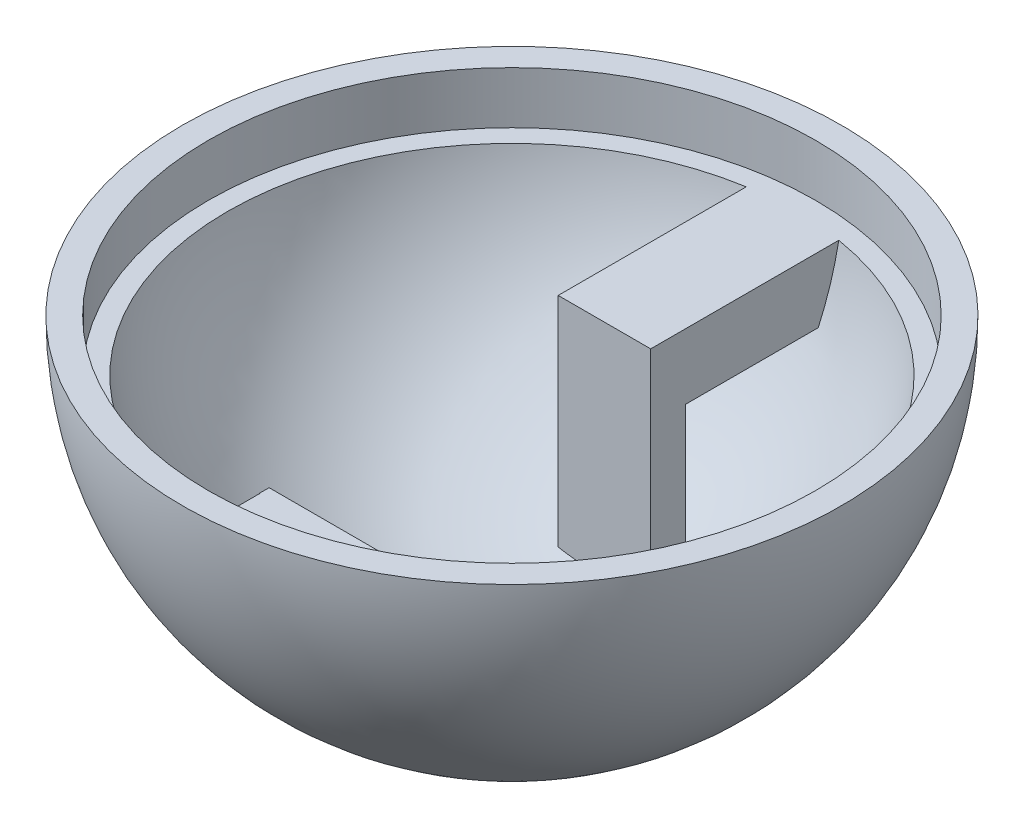
ISO-10303-21;
HEADER;
FILE_DESCRIPTION(('STEP AP214'),'2;1');
FILE_NAME('part.step','',(''),(''),'','','');
FILE_SCHEMA(('AUTOMOTIVE_DESIGN { 1 0 10303 214 1 1 1 1 }'));
ENDSEC;
DATA;
#1=APPLICATION_CONTEXT('core data for automotive mechanical design processes');
#2=APPLICATION_PROTOCOL_DEFINITION('international standard','automotive_design',2000,#1);
#3=PRODUCT_CONTEXT('',#1,'mechanical');
#4=PRODUCT('Part','Part','',(#3));
#5=PRODUCT_RELATED_PRODUCT_CATEGORY('part','',(#4));
#6=PRODUCT_DEFINITION_FORMATION('','',#4);
#7=PRODUCT_DEFINITION_CONTEXT('part definition',#1,'design');
#8=PRODUCT_DEFINITION('design','',#6,#7);
#9=PRODUCT_DEFINITION_SHAPE('','',#8);
#10=(LENGTH_UNIT() NAMED_UNIT(*) SI_UNIT(.MILLI.,.METRE.));
#11=(NAMED_UNIT(*) PLANE_ANGLE_UNIT() SI_UNIT($,.RADIAN.));
#12=(NAMED_UNIT(*) SI_UNIT($,.STERADIAN.) SOLID_ANGLE_UNIT());
#13=UNCERTAINTY_MEASURE_WITH_UNIT(LENGTH_MEASURE(1.E-05),#10,'distance_accuracy_value','');
#14=(GEOMETRIC_REPRESENTATION_CONTEXT(3) GLOBAL_UNCERTAINTY_ASSIGNED_CONTEXT((#13)) GLOBAL_UNIT_ASSIGNED_CONTEXT((#10,
#11,#12)) REPRESENTATION_CONTEXT('',''));
#15=CARTESIAN_POINT('',(0.,0.,0.));
#16=DIRECTION('',(0.,0.,1.));
#17=DIRECTION('',(1.,0.,0.));
#18=AXIS2_PLACEMENT_3D('',#15,#16,#17);
#19=CARTESIAN_POINT('',(0.,0.,0.));
#20=DIRECTION('',(0.,1.,0.));
#21=DIRECTION('',(-1.,0.,0.));
#22=AXIS2_PLACEMENT_3D('',#19,#20,#21);
#23=SPHERICAL_SURFACE('',#22,25.);
#24=CARTESIAN_POINT('',(-4.,0.,0.));
#25=DIRECTION('',(1.,0.,0.));
#26=DIRECTION('',(0.,0.,-1.));
#27=AXIS2_PLACEMENT_3D('',#24,#25,#26);
#28=CIRCLE('',#27,24.6779253585061);
#29=CARTESIAN_POINT('',(-4.,-4.5,-24.2641711171019));
#30=VERTEX_POINT('',#29);
#31=CARTESIAN_POINT('',(-4.,-10.1611564153927,-22.4889061606367));
#32=VERTEX_POINT('',#31);
#33=EDGE_CURVE('E380',#30,#32,#28,.F.);
#34=ORIENTED_EDGE('',*,*,#33,.F.);
#35=CARTESIAN_POINT('',(0.,-4.5,0.));
#36=DIRECTION('',(0.,1.,0.));
#37=DIRECTION('',(-1.,0.,0.));
#38=AXIS2_PLACEMENT_3D('',#35,#36,#37);
#39=CIRCLE('',#38,24.5916652547159);
#40=CARTESIAN_POINT('',(4.00000000000001,-4.5,-24.2641711171019));
#41=VERTEX_POINT('',#40);
#42=EDGE_CURVE('E268',#30,#41,#39,.T.);
#43=ORIENTED_EDGE('',*,*,#42,.T.);
#44=CARTESIAN_POINT('',(4.,0.,0.));
#45=DIRECTION('',(-1.,0.,0.));
#46=DIRECTION('',(0.,0.,1.));
#47=AXIS2_PLACEMENT_3D('',#44,#45,#46);
#48=CIRCLE('',#47,24.6779253585061);
#49=CARTESIAN_POINT('',(4.00000000000001,-10.1611564153927,-22.4889061606367));
#50=VERTEX_POINT('',#49);
#51=EDGE_CURVE('E378',#50,#41,#48,.F.);
#52=ORIENTED_EDGE('',*,*,#51,.F.);
#53=CARTESIAN_POINT('',(0.,-10.1611564153927,0.));
#54=DIRECTION('',(0.,1.,0.));
#55=DIRECTION('',(0.,0.,1.));
#56=AXIS2_PLACEMENT_3D('',#53,#54,#55);
#57=CIRCLE('',#56,22.8418672682844);
#58=EDGE_CURVE('E375',#32,#50,#57,.F.);
#59=ORIENTED_EDGE('',*,*,#58,.F.);
#60=EDGE_LOOP('',(#34,#43,#52,#59));
#61=FACE_BOUND('',#60,.T.);
#62=CARTESIAN_POINT('',(0.,0.,-11.));
#63=DIRECTION('',(0.,0.,-1.));
#64=DIRECTION('',(-1.,0.,0.));
#65=AXIS2_PLACEMENT_3D('',#62,#63,#64);
#66=CIRCLE('',#65,22.4499443206436);
#67=CARTESIAN_POINT('',(-4.,-22.0907220343745,-11.));
#68=VERTEX_POINT('',#67);
#69=CARTESIAN_POINT('',(4.,-22.0907220343745,-11.));
#70=VERTEX_POINT('',#69);
#71=EDGE_CURVE('E310',#68,#70,#66,.F.);
#72=ORIENTED_EDGE('',*,*,#71,.T.);
#73=CARTESIAN_POINT('',(4.00000000000001,0.,0.));
#74=DIRECTION('',(1.,0.,0.));
#75=DIRECTION('',(0.,0.,-1.));
#76=AXIS2_PLACEMENT_3D('',#73,#74,#75);
#77=CIRCLE('',#76,24.6779253585061);
#78=CARTESIAN_POINT('',(4.00000000000001,-23.3452350598575,-8.));
#79=VERTEX_POINT('',#78);
#80=EDGE_CURVE('E11',#70,#79,#77,.F.);
#81=ORIENTED_EDGE('',*,*,#80,.T.);
#82=CARTESIAN_POINT('',(0.,0.,-8.));
#83=DIRECTION('',(0.,0.,1.));
#84=DIRECTION('',(1.,0.,0.));
#85=AXIS2_PLACEMENT_3D('',#82,#83,#84);
#86=CIRCLE('',#85,23.685438564654);
#87=CARTESIAN_POINT('',(-3.99999999999999,-23.3452350598575,-8.));
#88=VERTEX_POINT('',#87);
#89=EDGE_CURVE('E47',#79,#88,#86,.F.);
#90=ORIENTED_EDGE('',*,*,#89,.T.);
#91=CARTESIAN_POINT('',(-3.99999999999999,0.,0.));
#92=DIRECTION('',(-1.,0.,0.));
#93=DIRECTION('',(0.,0.,1.));
#94=AXIS2_PLACEMENT_3D('',#91,#92,#93);
#95=CIRCLE('',#94,24.6779253585061);
#96=EDGE_CURVE('E313',#88,#68,#95,.F.);
#97=ORIENTED_EDGE('',*,*,#96,.T.);
#98=EDGE_LOOP('',(#72,#81,#90,#97));
#99=FACE_BOUND('',#98,.T.);
#100=CARTESIAN_POINT('',(0.,0.,12.));
#101=DIRECTION('',(0.,0.,-1.));
#102=DIRECTION('',(-1.,0.,0.));
#103=AXIS2_PLACEMENT_3D('',#100,#101,#102);
#104=CIRCLE('',#103,21.9317121994613);
#105=CARTESIAN_POINT('',(-9.,-20.,12.));
#106=VERTEX_POINT('',#105);
#107=CARTESIAN_POINT('',(9.00000000000001,-20.,12.));
#108=VERTEX_POINT('',#107);
#109=EDGE_CURVE('E298',#106,#108,#104,.F.);
#110=ORIENTED_EDGE('',*,*,#109,.T.);
#111=CARTESIAN_POINT('',(9.00000000000003,0.,0.));
#112=DIRECTION('',(1.,0.,0.));
#113=DIRECTION('',(0.,0.,-1.));
#114=AXIS2_PLACEMENT_3D('',#111,#112,#113);
#115=CIRCLE('',#114,23.3238075793812);
#116=CARTESIAN_POINT('',(9.,-19.4852120180609,12.8189903116906));
#117=VERTEX_POINT('',#116);
#118=EDGE_CURVE('E307',#108,#117,#115,.F.);
#119=ORIENTED_EDGE('',*,*,#118,.T.);
#120=CARTESIAN_POINT('',(0.,0.,12.8189903116906));
#121=DIRECTION('',(0.,0.,1.));
#122=DIRECTION('',(1.,0.,0.));
#123=AXIS2_PLACEMENT_3D('',#120,#121,#122);
#124=CIRCLE('',#123,21.4633056025577);
#125=CARTESIAN_POINT('',(-9.,-19.4852120180609,12.8189903116906));
#126=VERTEX_POINT('',#125);
#127=EDGE_CURVE('E304',#117,#126,#124,.F.);
#128=ORIENTED_EDGE('',*,*,#127,.T.);
#129=CARTESIAN_POINT('',(-8.99999999999995,0.,0.));
#130=DIRECTION('',(-1.,0.,0.));
#131=DIRECTION('',(0.,0.,1.));
#132=AXIS2_PLACEMENT_3D('',#129,#130,#131);
#133=CIRCLE('',#132,23.3238075793812);
#134=EDGE_CURVE('E301',#126,#106,#133,.F.);
#135=ORIENTED_EDGE('',*,*,#134,.T.);
#136=EDGE_LOOP('',(#110,#119,#128,#135));
#137=FACE_BOUND('',#136,.T.);
#138=CARTESIAN_POINT('',(0.,0.,11.));
#139=DIRECTION('',(0.,0.,1.));
#140=DIRECTION('',(1.,0.,0.));
#141=AXIS2_PLACEMENT_3D('',#138,#139,#140);
#142=CIRCLE('',#141,22.4499443206436);
#143=CARTESIAN_POINT('',(11.,-19.5703857907809,11.));
#144=VERTEX_POINT('',#143);
#145=CARTESIAN_POINT('',(-11.,-19.5703857907809,11.));
#146=VERTEX_POINT('',#145);
#147=EDGE_CURVE('E274',#144,#146,#142,.F.);
#148=ORIENTED_EDGE('',*,*,#147,.T.);
#149=CARTESIAN_POINT('',(-11.,0.,0.));
#150=DIRECTION('',(-1.,0.,0.));
#151=DIRECTION('',(0.,-1.,0.));
#152=AXIS2_PLACEMENT_3D('',#149,#150,#151);
#153=CIRCLE('',#152,22.4499443206436);
#154=CARTESIAN_POINT('',(-11.,-20.340845606808,9.49999999999999));
#155=VERTEX_POINT('',#154);
#156=EDGE_CURVE('E295',#146,#155,#153,.F.);
#157=ORIENTED_EDGE('',*,*,#156,.T.);
#158=CARTESIAN_POINT('',(0.,0.,9.49999999999999));
#159=DIRECTION('',(0.,0.,-1.));
#160=DIRECTION('',(-1.,0.,0.));
#161=AXIS2_PLACEMENT_3D('',#158,#159,#160);
#162=CIRCLE('',#161,23.1246621596944);
#163=CARTESIAN_POINT('',(-4.99999999999999,-22.5776438097513,9.49999999999999));
#164=VERTEX_POINT('',#163);
#165=EDGE_CURVE('E292',#155,#164,#162,.F.);
#166=ORIENTED_EDGE('',*,*,#165,.T.);
#167=CARTESIAN_POINT('',(-5.,0.,0.));
#168=DIRECTION('',(-1.,0.,0.));
#169=DIRECTION('',(0.,-1.,0.));
#170=AXIS2_PLACEMENT_3D('',#167,#168,#169);
#171=CIRCLE('',#170,24.4948974278318);
#172=CARTESIAN_POINT('',(-4.99999999999999,-23.86943652456,5.5));
#173=VERTEX_POINT('',#172);
#174=EDGE_CURVE('E289',#164,#173,#171,.F.);
#175=ORIENTED_EDGE('',*,*,#174,.T.);
#176=CARTESIAN_POINT('',(0.,0.,5.5));
#177=DIRECTION('',(0.,0.,-1.));
#178=DIRECTION('',(-1.,0.,0.));
#179=AXIS2_PLACEMENT_3D('',#176,#177,#178);
#180=CIRCLE('',#179,24.3874967965144);
#181=CARTESIAN_POINT('',(5.00000000000001,-23.86943652456,5.5));
#182=VERTEX_POINT('',#181);
#183=EDGE_CURVE('E286',#173,#182,#180,.F.);
#184=ORIENTED_EDGE('',*,*,#183,.T.);
#185=CARTESIAN_POINT('',(5.,0.,0.));
#186=DIRECTION('',(1.,0.,0.));
#187=DIRECTION('',(0.,0.,-1.));
#188=AXIS2_PLACEMENT_3D('',#185,#186,#187);
#189=CIRCLE('',#188,24.4948974278318);
#190=CARTESIAN_POINT('',(5.00000000000001,-22.5776438097513,9.49999999999999));
#191=VERTEX_POINT('',#190);
#192=EDGE_CURVE('E283',#182,#191,#189,.F.);
#193=ORIENTED_EDGE('',*,*,#192,.T.);
#194=CARTESIAN_POINT('',(0.,0.,9.49999999999998));
#195=DIRECTION('',(0.,0.,-1.));
#196=DIRECTION('',(-1.,0.,0.));
#197=AXIS2_PLACEMENT_3D('',#194,#195,#196);
#198=CIRCLE('',#197,23.1246621596944);
#199=CARTESIAN_POINT('',(11.,-20.340845606808,9.5));
#200=VERTEX_POINT('',#199);
#201=EDGE_CURVE('E280',#191,#200,#198,.F.);
#202=ORIENTED_EDGE('',*,*,#201,.T.);
#203=CARTESIAN_POINT('',(11.,0.,0.));
#204=DIRECTION('',(1.,0.,0.));
#205=DIRECTION('',(0.,1.,0.));
#206=AXIS2_PLACEMENT_3D('',#203,#204,#205);
#207=CIRCLE('',#206,22.4499443206437);
#208=EDGE_CURVE('E277',#200,#144,#207,.F.);
#209=ORIENTED_EDGE('',*,*,#208,.T.);
#210=EDGE_LOOP('',(#148,#157,#166,#175,#184,#193,#202,#209));
#211=FACE_BOUND('',#210,.T.);
#212=CARTESIAN_POINT('',(9.,0.,0.));
#213=DIRECTION('',(-1.,0.,0.));
#214=DIRECTION('',(0.,0.,1.));
#215=AXIS2_PLACEMENT_3D('',#212,#213,#214);
#216=CIRCLE('',#215,23.3238075793812);
#217=CARTESIAN_POINT('',(9.,-11.3983717753481,20.3488850031383));
#218=VERTEX_POINT('',#217);
#219=CARTESIAN_POINT('',(9.,-11.8983717753481,20.0606268370557));
#220=VERTEX_POINT('',#219);
#221=EDGE_CURVE('E356',#218,#220,#216,.F.);
#222=ORIENTED_EDGE('',*,*,#221,.F.);
#223=CARTESIAN_POINT('',(0.,-11.3983717753481,0.));
#224=DIRECTION('',(0.,-1.,0.));
#225=DIRECTION('',(0.,0.,-1.));
#226=AXIS2_PLACEMENT_3D('',#223,#224,#225);
#227=CIRCLE('',#226,22.2503285564719);
#228=CARTESIAN_POINT('',(-8.96730976026265,-11.3983717753481,20.3633120227149));
#229=VERTEX_POINT('',#228);
#230=EDGE_CURVE('E61',#229,#218,#227,.F.);
#231=ORIENTED_EDGE('',*,*,#230,.F.);
#232=CARTESIAN_POINT('',(-8.96730976026269,0.,0.));
#233=DIRECTION('',(1.,0.,0.));
#234=DIRECTION('',(0.,1.,0.));
#235=AXIS2_PLACEMENT_3D('',#232,#233,#234);
#236=CIRCLE('',#235,23.3363955156639);
#237=CARTESIAN_POINT('',(-8.96730976026265,-11.8983717753481,20.0752610134737));
#238=VERTEX_POINT('',#237);
#239=EDGE_CURVE('E189',#238,#229,#236,.F.);
#240=ORIENTED_EDGE('',*,*,#239,.F.);
#241=CARTESIAN_POINT('',(0.,-11.8983717753481,0.));
#242=DIRECTION('',(0.,1.,0.));
#243=DIRECTION('',(-1.,0.,0.));
#244=AXIS2_PLACEMENT_3D('',#241,#242,#243);
#245=CIRCLE('',#244,21.9870131917821);
#246=EDGE_CURVE('E192',#220,#238,#245,.F.);
#247=ORIENTED_EDGE('',*,*,#246,.F.);
#248=EDGE_LOOP('',(#222,#231,#240,#247));
#249=FACE_BOUND('',#248,.T.);
#250=ADVANCED_FACE('F39',(#61,#99,#137,#211,#249),#23,.F.);
#251=CARTESIAN_POINT('',(9.00000000000001,-21.9534358011981,12.8189903116905));
#252=DIRECTION('',(0.,0.,1.));
#253=DIRECTION('',(1.,0.,0.));
#254=AXIS2_PLACEMENT_3D('',#251,#252,#253);
#255=PLANE('',#254);
#256=DIRECTION('',(1.,0.,0.));
#257=VECTOR('',#256,1.);
#258=CARTESIAN_POINT('',(9.,-11.8983717753481,12.8189903116906));
#259=LINE('',#258,#257);
#260=CARTESIAN_POINT('',(-8.96730976026265,-11.8983717753481,12.8189903116906));
#261=VERTEX_POINT('',#260);
#262=CARTESIAN_POINT('',(9.,-11.8983717753481,12.8189903116906));
#263=VERTEX_POINT('',#262);
#264=EDGE_CURVE('E202',#261,#263,#259,.T.);
#265=ORIENTED_EDGE('',*,*,#264,.F.);
#266=DIRECTION('',(0.,-1.,0.));
#267=VECTOR('',#266,1.);
#268=CARTESIAN_POINT('',(-8.96730976026265,-11.3983717753481,12.8189903116906));
#269=LINE('',#268,#267);
#270=CARTESIAN_POINT('',(-8.96730976026265,-11.3983717753481,12.8189903116906));
#271=VERTEX_POINT('',#270);
#272=EDGE_CURVE('E187',#271,#261,#269,.T.);
#273=ORIENTED_EDGE('',*,*,#272,.F.);
#274=DIRECTION('',(1.,0.,0.));
#275=VECTOR('',#274,1.);
#276=CARTESIAN_POINT('',(9.,-11.3983717753481,12.8189903116905));
#277=LINE('',#276,#275);
#278=CARTESIAN_POINT('',(-9.,-11.3983717753481,12.8189903116906));
#279=VERTEX_POINT('',#278);
#280=EDGE_CURVE('E199',#279,#271,#277,.T.);
#281=ORIENTED_EDGE('',*,*,#280,.F.);
#282=DIRECTION('',(0.,1.,0.));
#283=VECTOR('',#282,1.);
#284=CARTESIAN_POINT('',(-9.,-21.9534358011981,12.8189903116906));
#285=LINE('',#284,#283);
#286=EDGE_CURVE('E220',#126,#279,#285,.T.);
#287=ORIENTED_EDGE('',*,*,#286,.F.);
#288=ORIENTED_EDGE('',*,*,#127,.F.);
#289=DIRECTION('',(0.,1.,0.));
#290=VECTOR('',#289,1.);
#291=CARTESIAN_POINT('',(9.00000000000001,-21.9534358011981,12.8189903116905));
#292=LINE('',#291,#290);
#293=EDGE_CURVE('E217',#117,#263,#292,.T.);
#294=ORIENTED_EDGE('',*,*,#293,.T.);
#295=EDGE_LOOP('',(#265,#273,#281,#287,#288,#294));
#296=FACE_BOUND('',#295,.T.);
#297=ADVANCED_FACE('F197',(#296),#255,.T.);
#298=CARTESIAN_POINT('',(-4.,-25.5,-11.));
#299=DIRECTION('',(0.,0.,-1.));
#300=DIRECTION('',(-1.,0.,0.));
#301=AXIS2_PLACEMENT_3D('',#298,#299,#300);
#302=PLANE('',#301);
#303=DIRECTION('',(0.,1.,0.));
#304=VECTOR('',#303,1.);
#305=CARTESIAN_POINT('',(-4.,-25.5,-11.));
#306=LINE('',#305,#304);
#307=CARTESIAN_POINT('',(-4.,-10.1611564153927,-11.));
#308=VERTEX_POINT('',#307);
#309=EDGE_CURVE('E335',#68,#308,#306,.T.);
#310=ORIENTED_EDGE('',*,*,#309,.T.);
#311=DIRECTION('',(-1.,0.,0.));
#312=VECTOR('',#311,1.);
#313=CARTESIAN_POINT('',(-4.,-10.1611564153927,-11.));
#314=LINE('',#313,#312);
#315=CARTESIAN_POINT('',(4.,-10.1611564153927,-11.));
#316=VERTEX_POINT('',#315);
#317=EDGE_CURVE('E368',#316,#308,#314,.T.);
#318=ORIENTED_EDGE('',*,*,#317,.F.);
#319=DIRECTION('',(0.,1.,0.));
#320=VECTOR('',#319,1.);
#321=CARTESIAN_POINT('',(4.,-25.5,-11.));
#322=LINE('',#321,#320);
#323=EDGE_CURVE('E343',#70,#316,#322,.T.);
#324=ORIENTED_EDGE('',*,*,#323,.F.);
#325=ORIENTED_EDGE('',*,*,#71,.F.);
#326=EDGE_LOOP('',(#310,#318,#324,#325));
#327=FACE_BOUND('',#326,.T.);
#328=ADVANCED_FACE('F397',(#327),#302,.T.);
#329=CARTESIAN_POINT('',(0.,0.,0.));
#330=DIRECTION('',(0.,1.,0.));
#331=DIRECTION('',(-1.,0.,0.));
#332=AXIS2_PLACEMENT_3D('',#329,#330,#331);
#333=PLANE('',#332);
#334=CARTESIAN_POINT('',(0.,0.,0.));
#335=DIRECTION('',(0.,1.,0.));
#336=DIRECTION('',(-1.,0.,0.));
#337=AXIS2_PLACEMENT_3D('',#334,#335,#336);
#338=CIRCLE('',#337,28.5);
#339=CARTESIAN_POINT('',(-28.5,0.,0.));
#340=VERTEX_POINT('',#339);
#341=EDGE_CURVE('E271',#340,#340,#338,.T.);
#342=ORIENTED_EDGE('',*,*,#341,.T.);
#343=EDGE_LOOP('',(#342));
#344=FACE_BOUND('',#343,.T.);
#345=CARTESIAN_POINT('',(0.,0.,0.));
#346=DIRECTION('',(0.,1.,0.));
#347=DIRECTION('',(-1.,0.,0.));
#348=AXIS2_PLACEMENT_3D('',#345,#346,#347);
#349=CIRCLE('',#348,26.25);
#350=CARTESIAN_POINT('',(-26.25,0.,0.));
#351=VERTEX_POINT('',#350);
#352=EDGE_CURVE('E262',#351,#351,#349,.T.);
#353=ORIENTED_EDGE('',*,*,#352,.F.);
#354=EDGE_LOOP('',(#353));
#355=FACE_BOUND('',#354,.T.);
#356=ADVANCED_FACE('F41',(#344,#355),#333,.T.);
#357=CARTESIAN_POINT('',(0.,0.,0.));
#358=DIRECTION('',(0.,1.,0.));
#359=DIRECTION('',(-1.,0.,0.));
#360=AXIS2_PLACEMENT_3D('',#357,#358,#359);
#361=SPHERICAL_SURFACE('',#360,28.5);
#362=CARTESIAN_POINT('',(-11.,0.,0.));
#363=DIRECTION('',(-1.,0.,0.));
#364=DIRECTION('',(0.,-1.,0.));
#365=AXIS2_PLACEMENT_3D('',#362,#363,#364);
#366=CIRCLE('',#365,26.2916336502698);
#367=CARTESIAN_POINT('',(-11.,-23.8799078725191,11.));
#368=VERTEX_POINT('',#367);
#369=CARTESIAN_POINT('',(-11.,-24.5153013442625,9.49999999999999));
#370=VERTEX_POINT('',#369);
#371=EDGE_CURVE('E260',#368,#370,#366,.F.);
#372=ORIENTED_EDGE('',*,*,#371,.F.);
#373=CARTESIAN_POINT('',(0.,0.,11.));
#374=DIRECTION('',(0.,0.,1.));
#375=DIRECTION('',(1.,0.,0.));
#376=AXIS2_PLACEMENT_3D('',#373,#374,#375);
#377=CIRCLE('',#376,26.2916336502698);
#378=CARTESIAN_POINT('',(11.,-23.8799078725191,11.));
#379=VERTEX_POINT('',#378);
#380=EDGE_CURVE('E226',#379,#368,#377,.F.);
#381=ORIENTED_EDGE('',*,*,#380,.F.);
#382=CARTESIAN_POINT('',(11.,0.,0.));
#383=DIRECTION('',(1.,0.,0.));
#384=DIRECTION('',(0.,1.,0.));
#385=AXIS2_PLACEMENT_3D('',#382,#383,#384);
#386=CIRCLE('',#385,26.2916336502698);
#387=CARTESIAN_POINT('',(11.,-24.5153013442625,9.5));
#388=VERTEX_POINT('',#387);
#389=EDGE_CURVE('E247',#388,#379,#386,.F.);
#390=ORIENTED_EDGE('',*,*,#389,.F.);
#391=CARTESIAN_POINT('',(0.,0.,9.49999999999998));
#392=DIRECTION('',(0.,0.,-1.));
#393=DIRECTION('',(-1.,0.,0.));
#394=AXIS2_PLACEMENT_3D('',#391,#392,#393);
#395=CIRCLE('',#394,26.8700576850888);
#396=CARTESIAN_POINT('',(5.00000000000001,-26.4007575648882,9.49999999999999));
#397=VERTEX_POINT('',#396);
#398=EDGE_CURVE('E250',#397,#388,#395,.F.);
#399=ORIENTED_EDGE('',*,*,#398,.F.);
#400=CARTESIAN_POINT('',(5.,0.,0.));
#401=DIRECTION('',(1.,0.,0.));
#402=DIRECTION('',(0.,0.,-1.));
#403=AXIS2_PLACEMENT_3D('',#400,#401,#402);
#404=CIRCLE('',#403,28.0579756931964);
#405=CARTESIAN_POINT('',(5.00000000000001,-27.5136329843952,5.5));
#406=VERTEX_POINT('',#405);
#407=EDGE_CURVE('E252',#406,#397,#404,.F.);
#408=ORIENTED_EDGE('',*,*,#407,.F.);
#409=CARTESIAN_POINT('',(0.,0.,5.5));
#410=DIRECTION('',(0.,0.,-1.));
#411=DIRECTION('',(-1.,0.,0.));
#412=AXIS2_PLACEMENT_3D('',#409,#410,#411);
#413=CIRCLE('',#412,27.9642629082191);
#414=CARTESIAN_POINT('',(-4.99999999999999,-27.5136329843952,5.5));
#415=VERTEX_POINT('',#414);
#416=EDGE_CURVE('E254',#415,#406,#413,.F.);
#417=ORIENTED_EDGE('',*,*,#416,.F.);
#418=CARTESIAN_POINT('',(-5.,0.,0.));
#419=DIRECTION('',(-1.,0.,0.));
#420=DIRECTION('',(0.,-1.,0.));
#421=AXIS2_PLACEMENT_3D('',#418,#419,#420);
#422=CIRCLE('',#421,28.0579756931964);
#423=CARTESIAN_POINT('',(-4.99999999999999,-26.4007575648882,9.49999999999999));
#424=VERTEX_POINT('',#423);
#425=EDGE_CURVE('E256',#424,#415,#422,.F.);
#426=ORIENTED_EDGE('',*,*,#425,.F.);
#427=CARTESIAN_POINT('',(0.,0.,9.49999999999999));
#428=DIRECTION('',(0.,0.,-1.));
#429=DIRECTION('',(-1.,0.,0.));
#430=AXIS2_PLACEMENT_3D('',#427,#428,#429);
#431=CIRCLE('',#430,26.8700576850888);
#432=EDGE_CURVE('E258',#370,#424,#431,.F.);
#433=ORIENTED_EDGE('',*,*,#432,.F.);
#434=EDGE_LOOP('',(#372,#381,#390,#399,#408,#417,#426,#433));
#435=FACE_BOUND('',#434,.T.);
#436=ORIENTED_EDGE('',*,*,#341,.F.);
#437=EDGE_LOOP('',(#436));
#438=FACE_BOUND('',#437,.T.);
#439=ADVANCED_FACE('F418',(#435,#438),#361,.T.);
#440=CARTESIAN_POINT('',(0.,-4.5,0.));
#441=DIRECTION('',(0.,-1.,0.));
#442=DIRECTION('',(1.,0.,0.));
#443=AXIS2_PLACEMENT_3D('',#440,#441,#442);
#444=PLANE('',#443);
#445=ORIENTED_EDGE('',*,*,#42,.F.);
#446=DIRECTION('',(0.,0.,1.));
#447=VECTOR('',#446,1.);
#448=CARTESIAN_POINT('',(-4.,-4.5,-8.));
#449=LINE('',#448,#447);
#450=CARTESIAN_POINT('',(-4.,-4.5,-8.));
#451=VERTEX_POINT('',#450);
#452=EDGE_CURVE('E383',#30,#451,#449,.T.);
#453=ORIENTED_EDGE('',*,*,#452,.T.);
#454=DIRECTION('',(1.,0.,0.));
#455=VECTOR('',#454,1.);
#456=CARTESIAN_POINT('',(-4.,-4.5,-8.));
#457=LINE('',#456,#455);
#458=CARTESIAN_POINT('',(4.,-4.5,-8.));
#459=VERTEX_POINT('',#458);
#460=EDGE_CURVE('E338',#451,#459,#457,.T.);
#461=ORIENTED_EDGE('',*,*,#460,.T.);
#462=DIRECTION('',(0.,0.,-1.));
#463=VECTOR('',#462,1.);
#464=CARTESIAN_POINT('',(4.,-4.5,-8.));
#465=LINE('',#464,#463);
#466=EDGE_CURVE('E331',#459,#41,#465,.T.);
#467=ORIENTED_EDGE('',*,*,#466,.T.);
#468=EDGE_LOOP('',(#445,#453,#461,#467));
#469=FACE_BOUND('',#468,.T.);
#470=CARTESIAN_POINT('',(0.,-4.5,0.));
#471=DIRECTION('',(0.,1.,0.));
#472=DIRECTION('',(-1.,0.,0.));
#473=AXIS2_PLACEMENT_3D('',#470,#471,#472);
#474=CIRCLE('',#473,26.25);
#475=CARTESIAN_POINT('',(-26.25,-4.5,0.));
#476=VERTEX_POINT('',#475);
#477=EDGE_CURVE('E265',#476,#476,#474,.T.);
#478=ORIENTED_EDGE('',*,*,#477,.T.);
#479=EDGE_LOOP('',(#478));
#480=FACE_BOUND('',#479,.T.);
#481=ADVANCED_FACE('F387',(#469,#480),#444,.F.);
#482=CARTESIAN_POINT('',(0.,0.,0.));
#483=DIRECTION('',(0.,1.,0.));
#484=DIRECTION('',(-1.,0.,0.));
#485=AXIS2_PLACEMENT_3D('',#482,#483,#484);
#486=CYLINDRICAL_SURFACE('',#485,26.25);
#487=ORIENTED_EDGE('',*,*,#477,.F.);
#488=EDGE_LOOP('',(#487));
#489=FACE_BOUND('',#488,.T.);
#490=ORIENTED_EDGE('',*,*,#352,.T.);
#491=EDGE_LOOP('',(#490));
#492=FACE_BOUND('',#491,.T.);
#493=ADVANCED_FACE('F425',(#489,#492),#486,.F.);
#494=CARTESIAN_POINT('',(-11.,-33.,9.49999999999999));
#495=DIRECTION('',(-1.,0.,0.));
#496=DIRECTION('',(0.,-1.,0.));
#497=AXIS2_PLACEMENT_3D('',#494,#495,#496);
#498=PLANE('',#497);
#499=ORIENTED_EDGE('',*,*,#371,.T.);
#500=DIRECTION('',(0.,1.,0.));
#501=VECTOR('',#500,1.);
#502=CARTESIAN_POINT('',(-11.,-33.,9.49999999999999));
#503=LINE('',#502,#501);
#504=EDGE_CURVE('E223',#370,#155,#503,.T.);
#505=ORIENTED_EDGE('',*,*,#504,.T.);
#506=ORIENTED_EDGE('',*,*,#156,.F.);
#507=DIRECTION('',(0.,1.,0.));
#508=VECTOR('',#507,1.);
#509=CARTESIAN_POINT('',(-11.,-33.,11.));
#510=LINE('',#509,#508);
#511=EDGE_CURVE('E219',#368,#146,#510,.T.);
#512=ORIENTED_EDGE('',*,*,#511,.F.);
#513=EDGE_LOOP('',(#499,#505,#506,#512));
#514=FACE_BOUND('',#513,.T.);
#515=ADVANCED_FACE('F436',(#514),#498,.F.);
#516=CARTESIAN_POINT('',(-11.,-33.,9.49999999999999));
#517=DIRECTION('',(0.,0.,-1.));
#518=DIRECTION('',(-1.,0.,0.));
#519=AXIS2_PLACEMENT_3D('',#516,#517,#518);
#520=PLANE('',#519);
#521=ORIENTED_EDGE('',*,*,#432,.T.);
#522=DIRECTION('',(0.,1.,0.));
#523=VECTOR('',#522,1.);
#524=CARTESIAN_POINT('',(-4.99999999999999,-33.,9.49999999999999));
#525=LINE('',#524,#523);
#526=EDGE_CURVE('E227',#424,#164,#525,.T.);
#527=ORIENTED_EDGE('',*,*,#526,.T.);
#528=ORIENTED_EDGE('',*,*,#165,.F.);
#529=ORIENTED_EDGE('',*,*,#504,.F.);
#530=EDGE_LOOP('',(#521,#527,#528,#529));
#531=FACE_BOUND('',#530,.T.);
#532=ADVANCED_FACE('F441',(#531),#520,.F.);
#533=CARTESIAN_POINT('',(-4.99999999999999,-33.,9.49999999999999));
#534=DIRECTION('',(-1.,0.,0.));
#535=DIRECTION('',(0.,-1.,0.));
#536=AXIS2_PLACEMENT_3D('',#533,#534,#535);
#537=PLANE('',#536);
#538=ORIENTED_EDGE('',*,*,#425,.T.);
#539=DIRECTION('',(0.,1.,0.));
#540=VECTOR('',#539,1.);
#541=CARTESIAN_POINT('',(-4.99999999999999,-33.,5.5));
#542=LINE('',#541,#540);
#543=EDGE_CURVE('E230',#415,#173,#542,.T.);
#544=ORIENTED_EDGE('',*,*,#543,.T.);
#545=ORIENTED_EDGE('',*,*,#174,.F.);
#546=ORIENTED_EDGE('',*,*,#526,.F.);
#547=EDGE_LOOP('',(#538,#544,#545,#546));
#548=FACE_BOUND('',#547,.T.);
#549=ADVANCED_FACE('F465',(#548),#537,.F.);
#550=CARTESIAN_POINT('',(-4.99999999999999,-33.,5.5));
#551=DIRECTION('',(0.,0.,-1.));
#552=DIRECTION('',(-1.,0.,0.));
#553=AXIS2_PLACEMENT_3D('',#550,#551,#552);
#554=PLANE('',#553);
#555=ORIENTED_EDGE('',*,*,#416,.T.);
#556=DIRECTION('',(0.,1.,0.));
#557=VECTOR('',#556,1.);
#558=CARTESIAN_POINT('',(5.00000000000001,-33.,5.5));
#559=LINE('',#558,#557);
#560=EDGE_CURVE('E233',#406,#182,#559,.T.);
#561=ORIENTED_EDGE('',*,*,#560,.T.);
#562=ORIENTED_EDGE('',*,*,#183,.F.);
#563=ORIENTED_EDGE('',*,*,#543,.F.);
#564=EDGE_LOOP('',(#555,#561,#562,#563));
#565=FACE_BOUND('',#564,.T.);
#566=ADVANCED_FACE('F461',(#565),#554,.F.);
#567=CARTESIAN_POINT('',(5.00000000000001,-33.,5.5));
#568=DIRECTION('',(1.,0.,0.));
#569=DIRECTION('',(0.,0.,-1.));
#570=AXIS2_PLACEMENT_3D('',#567,#568,#569);
#571=PLANE('',#570);
#572=ORIENTED_EDGE('',*,*,#407,.T.);
#573=DIRECTION('',(0.,1.,0.));
#574=VECTOR('',#573,1.);
#575=CARTESIAN_POINT('',(5.00000000000001,-33.,9.49999999999999));
#576=LINE('',#575,#574);
#577=EDGE_CURVE('E236',#397,#191,#576,.T.);
#578=ORIENTED_EDGE('',*,*,#577,.T.);
#579=ORIENTED_EDGE('',*,*,#192,.F.);
#580=ORIENTED_EDGE('',*,*,#560,.F.);
#581=EDGE_LOOP('',(#572,#578,#579,#580));
#582=FACE_BOUND('',#581,.T.);
#583=ADVANCED_FACE('F457',(#582),#571,.F.);
#584=CARTESIAN_POINT('',(5.00000000000001,-33.,9.49999999999999));
#585=DIRECTION('',(0.,0.,-1.));
#586=DIRECTION('',(-1.,0.,0.));
#587=AXIS2_PLACEMENT_3D('',#584,#585,#586);
#588=PLANE('',#587);
#589=ORIENTED_EDGE('',*,*,#398,.T.);
#590=DIRECTION('',(0.,1.,0.));
#591=VECTOR('',#590,1.);
#592=CARTESIAN_POINT('',(11.,-33.,9.5));
#593=LINE('',#592,#591);
#594=EDGE_CURVE('E239',#388,#200,#593,.T.);
#595=ORIENTED_EDGE('',*,*,#594,.T.);
#596=ORIENTED_EDGE('',*,*,#201,.F.);
#597=ORIENTED_EDGE('',*,*,#577,.F.);
#598=EDGE_LOOP('',(#589,#595,#596,#597));
#599=FACE_BOUND('',#598,.T.);
#600=ADVANCED_FACE('F453',(#599),#588,.F.);
#601=CARTESIAN_POINT('',(11.,-33.,9.5));
#602=DIRECTION('',(1.,0.,0.));
#603=DIRECTION('',(0.,1.,0.));
#604=AXIS2_PLACEMENT_3D('',#601,#602,#603);
#605=PLANE('',#604);
#606=ORIENTED_EDGE('',*,*,#389,.T.);
#607=DIRECTION('',(0.,1.,0.));
#608=VECTOR('',#607,1.);
#609=CARTESIAN_POINT('',(11.,-33.,11.));
#610=LINE('',#609,#608);
#611=EDGE_CURVE('E242',#379,#144,#610,.T.);
#612=ORIENTED_EDGE('',*,*,#611,.T.);
#613=ORIENTED_EDGE('',*,*,#208,.F.);
#614=ORIENTED_EDGE('',*,*,#594,.F.);
#615=EDGE_LOOP('',(#606,#612,#613,#614));
#616=FACE_BOUND('',#615,.T.);
#617=ADVANCED_FACE('F449',(#616),#605,.F.);
#618=CARTESIAN_POINT('',(-11.,-33.,11.));
#619=DIRECTION('',(0.,0.,1.));
#620=DIRECTION('',(1.,0.,0.));
#621=AXIS2_PLACEMENT_3D('',#618,#619,#620);
#622=PLANE('',#621);
#623=ORIENTED_EDGE('',*,*,#380,.T.);
#624=ORIENTED_EDGE('',*,*,#511,.T.);
#625=ORIENTED_EDGE('',*,*,#147,.F.);
#626=ORIENTED_EDGE('',*,*,#611,.F.);
#627=EDGE_LOOP('',(#623,#624,#625,#626));
#628=FACE_BOUND('',#627,.T.);
#629=ADVANCED_FACE('F446',(#628),#622,.F.);
#630=CARTESIAN_POINT('',(9.00000000000001,-21.9534358011981,12.));
#631=DIRECTION('',(1.,0.,0.));
#632=DIRECTION('',(0.,0.,-1.));
#633=AXIS2_PLACEMENT_3D('',#630,#631,#632);
#634=PLANE('',#633);
#635=ORIENTED_EDGE('',*,*,#118,.F.);
#636=DIRECTION('',(0.,1.,0.));
#637=VECTOR('',#636,1.);
#638=CARTESIAN_POINT('',(9.00000000000001,-21.9534358011981,12.));
#639=LINE('',#638,#637);
#640=CARTESIAN_POINT('',(9.00000000000001,-11.3983717753481,12.));
#641=VERTEX_POINT('',#640);
#642=EDGE_CURVE('E209',#108,#641,#639,.T.);
#643=ORIENTED_EDGE('',*,*,#642,.T.);
#644=DIRECTION('',(0.,0.,-1.));
#645=VECTOR('',#644,1.);
#646=CARTESIAN_POINT('',(9.00000000000001,-11.3983717753481,12.));
#647=LINE('',#646,#645);
#648=EDGE_CURVE('E54',#218,#641,#647,.T.);
#649=ORIENTED_EDGE('',*,*,#648,.F.);
#650=ORIENTED_EDGE('',*,*,#221,.T.);
#651=DIRECTION('',(0.,0.,-1.));
#652=VECTOR('',#651,1.);
#653=CARTESIAN_POINT('',(9.,-11.8983717753481,23.8189903116905));
#654=LINE('',#653,#652);
#655=EDGE_CURVE('E355',#220,#263,#654,.T.);
#656=ORIENTED_EDGE('',*,*,#655,.T.);
#657=ORIENTED_EDGE('',*,*,#293,.F.);
#658=EDGE_LOOP('',(#635,#643,#649,#650,#656,#657));
#659=FACE_BOUND('',#658,.T.);
#660=ADVANCED_FACE('F353',(#659),#634,.T.);
#661=CARTESIAN_POINT('',(-9.,-21.9534358011981,12.));
#662=DIRECTION('',(-1.,0.,0.));
#663=DIRECTION('',(0.,0.,1.));
#664=AXIS2_PLACEMENT_3D('',#661,#662,#663);
#665=PLANE('',#664);
#666=ORIENTED_EDGE('',*,*,#134,.F.);
#667=ORIENTED_EDGE('',*,*,#286,.T.);
#668=DIRECTION('',(0.,0.,1.));
#669=VECTOR('',#668,1.);
#670=CARTESIAN_POINT('',(-9.,-11.3983717753481,12.));
#671=LINE('',#670,#669);
#672=CARTESIAN_POINT('',(-9.,-11.3983717753481,12.));
#673=VERTEX_POINT('',#672);
#674=EDGE_CURVE('E208',#673,#279,#671,.T.);
#675=ORIENTED_EDGE('',*,*,#674,.F.);
#676=DIRECTION('',(0.,1.,0.));
#677=VECTOR('',#676,1.);
#678=CARTESIAN_POINT('',(-9.,-21.9534358011981,12.));
#679=LINE('',#678,#677);
#680=EDGE_CURVE('E211',#106,#673,#679,.T.);
#681=ORIENTED_EDGE('',*,*,#680,.F.);
#682=EDGE_LOOP('',(#666,#667,#675,#681));
#683=FACE_BOUND('',#682,.T.);
#684=ADVANCED_FACE('F350',(#683),#665,.T.);
#685=CARTESIAN_POINT('',(9.00000000000001,-21.9534358011981,12.));
#686=DIRECTION('',(0.,0.,-1.));
#687=DIRECTION('',(-1.,0.,0.));
#688=AXIS2_PLACEMENT_3D('',#685,#686,#687);
#689=PLANE('',#688);
#690=ORIENTED_EDGE('',*,*,#109,.F.);
#691=ORIENTED_EDGE('',*,*,#680,.T.);
#692=DIRECTION('',(-1.,0.,0.));
#693=VECTOR('',#692,1.);
#694=CARTESIAN_POINT('',(9.00000000000001,-11.3983717753481,12.));
#695=LINE('',#694,#693);
#696=EDGE_CURVE('E213',#641,#673,#695,.T.);
#697=ORIENTED_EDGE('',*,*,#696,.F.);
#698=ORIENTED_EDGE('',*,*,#642,.F.);
#699=EDGE_LOOP('',(#690,#691,#697,#698));
#700=FACE_BOUND('',#699,.T.);
#701=ADVANCED_FACE('F346',(#700),#689,.T.);
#702=CARTESIAN_POINT('',(0.,-11.3983717753481,0.));
#703=DIRECTION('',(0.,-1.,0.));
#704=DIRECTION('',(1.,0.,0.));
#705=AXIS2_PLACEMENT_3D('',#702,#703,#704);
#706=PLANE('',#705);
#707=ORIENTED_EDGE('',*,*,#648,.T.);
#708=ORIENTED_EDGE('',*,*,#696,.T.);
#709=ORIENTED_EDGE('',*,*,#674,.T.);
#710=ORIENTED_EDGE('',*,*,#280,.T.);
#711=DIRECTION('',(0.,0.,-1.));
#712=VECTOR('',#711,1.);
#713=CARTESIAN_POINT('',(-8.96730976026265,-11.3983717753481,23.8189903116905));
#714=LINE('',#713,#712);
#715=EDGE_CURVE('E183',#229,#271,#714,.T.);
#716=ORIENTED_EDGE('',*,*,#715,.F.);
#717=ORIENTED_EDGE('',*,*,#230,.T.);
#718=EDGE_LOOP('',(#707,#708,#709,#710,#716,#717));
#719=FACE_BOUND('',#718,.T.);
#720=ADVANCED_FACE('F205',(#719),#706,.F.);
#721=CARTESIAN_POINT('',(4.00000000000001,-25.5,-8.));
#722=DIRECTION('',(1.,0.,0.));
#723=DIRECTION('',(0.,0.,-1.));
#724=AXIS2_PLACEMENT_3D('',#721,#722,#723);
#725=PLANE('',#724);
#726=ORIENTED_EDGE('',*,*,#80,.F.);
#727=ORIENTED_EDGE('',*,*,#323,.T.);
#728=DIRECTION('',(0.,0.,1.));
#729=VECTOR('',#728,1.);
#730=CARTESIAN_POINT('',(4.00000000000001,-10.1611564153927,-26.));
#731=LINE('',#730,#729);
#732=EDGE_CURVE('E373',#50,#316,#731,.T.);
#733=ORIENTED_EDGE('',*,*,#732,.F.);
#734=ORIENTED_EDGE('',*,*,#51,.T.);
#735=ORIENTED_EDGE('',*,*,#466,.F.);
#736=DIRECTION('',(0.,1.,0.));
#737=VECTOR('',#736,1.);
#738=CARTESIAN_POINT('',(4.00000000000001,-25.5,-8.));
#739=LINE('',#738,#737);
#740=EDGE_CURVE('E324',#79,#459,#739,.T.);
#741=ORIENTED_EDGE('',*,*,#740,.F.);
#742=EDGE_LOOP('',(#726,#727,#733,#734,#735,#741));
#743=FACE_BOUND('',#742,.T.);
#744=ADVANCED_FACE('F328',(#743),#725,.T.);
#745=CARTESIAN_POINT('',(-3.99999999999999,-25.5,-8.));
#746=DIRECTION('',(0.,0.,1.));
#747=DIRECTION('',(1.,0.,0.));
#748=AXIS2_PLACEMENT_3D('',#745,#746,#747);
#749=PLANE('',#748);
#750=ORIENTED_EDGE('',*,*,#89,.F.);
#751=ORIENTED_EDGE('',*,*,#740,.T.);
#752=ORIENTED_EDGE('',*,*,#460,.F.);
#753=DIRECTION('',(0.,1.,0.));
#754=VECTOR('',#753,1.);
#755=CARTESIAN_POINT('',(-3.99999999999999,-25.5,-8.));
#756=LINE('',#755,#754);
#757=EDGE_CURVE('E326',#88,#451,#756,.T.);
#758=ORIENTED_EDGE('',*,*,#757,.F.);
#759=EDGE_LOOP('',(#750,#751,#752,#758));
#760=FACE_BOUND('',#759,.T.);
#761=ADVANCED_FACE('F322',(#760),#749,.T.);
#762=CARTESIAN_POINT('',(-3.99999999999999,-25.5,-8.));
#763=DIRECTION('',(-1.,0.,0.));
#764=DIRECTION('',(0.,0.,1.));
#765=AXIS2_PLACEMENT_3D('',#762,#763,#764);
#766=PLANE('',#765);
#767=ORIENTED_EDGE('',*,*,#96,.F.);
#768=ORIENTED_EDGE('',*,*,#757,.T.);
#769=ORIENTED_EDGE('',*,*,#452,.F.);
#770=ORIENTED_EDGE('',*,*,#33,.T.);
#771=DIRECTION('',(0.,0.,1.));
#772=VECTOR('',#771,1.);
#773=CARTESIAN_POINT('',(-3.99999999999999,-10.1611564153927,-26.));
#774=LINE('',#773,#772);
#775=EDGE_CURVE('E371',#32,#308,#774,.T.);
#776=ORIENTED_EDGE('',*,*,#775,.T.);
#777=ORIENTED_EDGE('',*,*,#309,.F.);
#778=EDGE_LOOP('',(#767,#768,#769,#770,#776,#777));
#779=FACE_BOUND('',#778,.T.);
#780=ADVANCED_FACE('F400',(#779),#766,.T.);
#781=CARTESIAN_POINT('',(-3.99999999999999,-10.1611564153927,-26.));
#782=DIRECTION('',(0.,1.,0.));
#783=DIRECTION('',(0.,0.,1.));
#784=AXIS2_PLACEMENT_3D('',#781,#782,#783);
#785=PLANE('',#784);
#786=ORIENTED_EDGE('',*,*,#775,.F.);
#787=ORIENTED_EDGE('',*,*,#58,.T.);
#788=ORIENTED_EDGE('',*,*,#732,.T.);
#789=ORIENTED_EDGE('',*,*,#317,.T.);
#790=EDGE_LOOP('',(#786,#787,#788,#789));
#791=FACE_BOUND('',#790,.T.);
#792=ADVANCED_FACE('F395',(#791),#785,.F.);
#793=CARTESIAN_POINT('',(-8.96730976026265,-11.3983717753481,23.8189903116905));
#794=DIRECTION('',(1.,0.,0.));
#795=DIRECTION('',(0.,1.,0.));
#796=AXIS2_PLACEMENT_3D('',#793,#794,#795);
#797=PLANE('',#796);
#798=DIRECTION('',(0.,0.,-1.));
#799=VECTOR('',#798,1.);
#800=CARTESIAN_POINT('',(-8.96730976026265,-11.8983717753481,23.8189903116905));
#801=LINE('',#800,#799);
#802=EDGE_CURVE('E193',#238,#261,#801,.T.);
#803=ORIENTED_EDGE('',*,*,#802,.F.);
#804=ORIENTED_EDGE('',*,*,#239,.T.);
#805=ORIENTED_EDGE('',*,*,#715,.T.);
#806=ORIENTED_EDGE('',*,*,#272,.T.);
#807=EDGE_LOOP('',(#803,#804,#805,#806));
#808=FACE_BOUND('',#807,.T.);
#809=ADVANCED_FACE('F186',(#808),#797,.F.);
#810=CARTESIAN_POINT('',(9.,-11.8983717753481,23.8189903116905));
#811=DIRECTION('',(0.,1.,0.));
#812=DIRECTION('',(-1.,0.,0.));
#813=AXIS2_PLACEMENT_3D('',#810,#811,#812);
#814=PLANE('',#813);
#815=ORIENTED_EDGE('',*,*,#655,.F.);
#816=ORIENTED_EDGE('',*,*,#246,.T.);
#817=ORIENTED_EDGE('',*,*,#802,.T.);
#818=ORIENTED_EDGE('',*,*,#264,.T.);
#819=EDGE_LOOP('',(#815,#816,#817,#818));
#820=FACE_BOUND('',#819,.T.);
#821=ADVANCED_FACE('F360',(#820),#814,.F.);
#822=CLOSED_SHELL('',(#250,#297,#328,#356,#439,#481,#493,#515,#532,#549,#566,#583,#600,#617,
#629,#660,#684,#701,#720,#744,#761,#780,#792,#809,#821));
#823=MANIFOLD_SOLID_BREP('B2',#822);
#824=ADVANCED_BREP_SHAPE_REPRESENTATION('',(#18,#823),#14);
#825=SHAPE_DEFINITION_REPRESENTATION(#9,#824);
ENDSEC;
END-ISO-10303-21;
